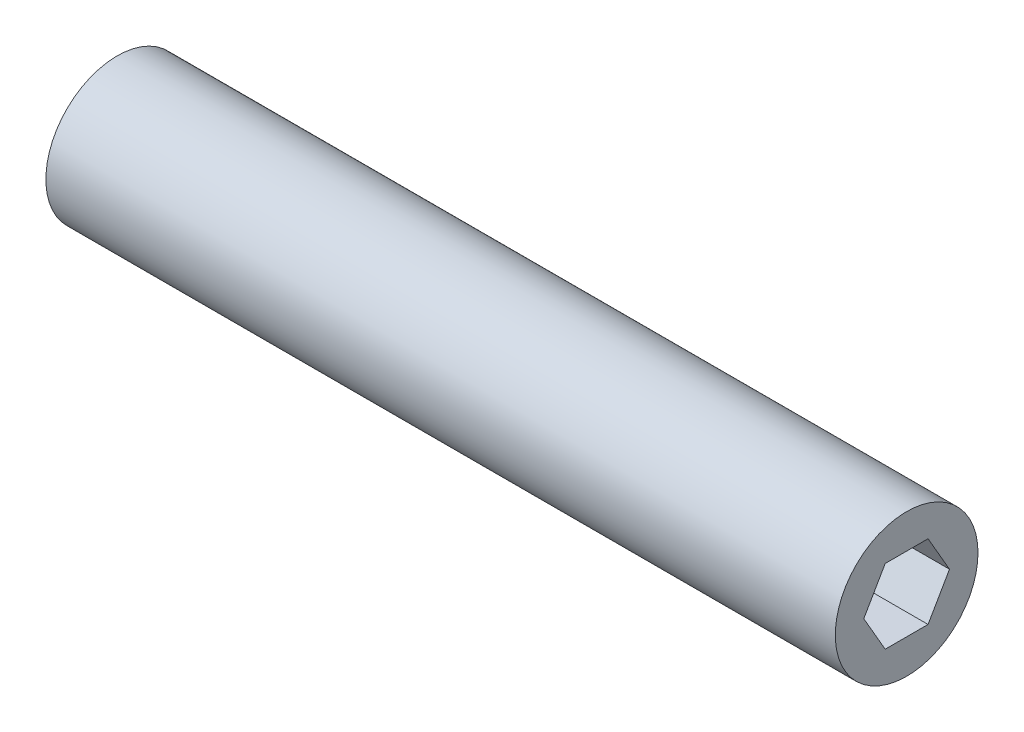
ISO-10303-21;
HEADER;
FILE_DESCRIPTION(('STEP AP214'),'2;1');
FILE_NAME('part.step','',(''),(''),'','','');
FILE_SCHEMA(('AUTOMOTIVE_DESIGN { 1 0 10303 214 1 1 1 1 }'));
ENDSEC;
DATA;
#1=APPLICATION_CONTEXT('core data for automotive mechanical design processes');
#2=APPLICATION_PROTOCOL_DEFINITION('international standard','automotive_design',2000,#1);
#3=PRODUCT_CONTEXT('',#1,'mechanical');
#4=PRODUCT('Part','Part','',(#3));
#5=PRODUCT_RELATED_PRODUCT_CATEGORY('part','',(#4));
#6=PRODUCT_DEFINITION_FORMATION('','',#4);
#7=PRODUCT_DEFINITION_CONTEXT('part definition',#1,'design');
#8=PRODUCT_DEFINITION('design','',#6,#7);
#9=PRODUCT_DEFINITION_SHAPE('','',#8);
#10=(LENGTH_UNIT() NAMED_UNIT(*) SI_UNIT(.MILLI.,.METRE.));
#11=(NAMED_UNIT(*) PLANE_ANGLE_UNIT() SI_UNIT($,.RADIAN.));
#12=(NAMED_UNIT(*) SI_UNIT($,.STERADIAN.) SOLID_ANGLE_UNIT());
#13=UNCERTAINTY_MEASURE_WITH_UNIT(LENGTH_MEASURE(1.E-05),#10,'distance_accuracy_value','');
#14=(GEOMETRIC_REPRESENTATION_CONTEXT(3) GLOBAL_UNCERTAINTY_ASSIGNED_CONTEXT((#13)) GLOBAL_UNIT_ASSIGNED_CONTEXT((#10,
#11,#12)) REPRESENTATION_CONTEXT('',''));
#15=CARTESIAN_POINT('',(0.,0.,0.));
#16=DIRECTION('',(0.,0.,1.));
#17=DIRECTION('',(1.,0.,0.));
#18=AXIS2_PLACEMENT_3D('',#15,#16,#17);
#19=CARTESIAN_POINT('',(140.49375,0.,0.));
#20=DIRECTION('',(1.,0.,0.));
#21=DIRECTION('',(0.,0.,-1.));
#22=AXIS2_PLACEMENT_3D('',#19,#20,#21);
#23=PLANE('',#22);
#24=CARTESIAN_POINT('',(140.49375,0.,0.));
#25=DIRECTION('',(1.,0.,0.));
#26=DIRECTION('',(0.,0.,-1.));
#27=AXIS2_PLACEMENT_3D('',#24,#25,#26);
#28=CIRCLE('',#27,12.7);
#29=CARTESIAN_POINT('',(140.49375,0.,-12.7));
#30=VERTEX_POINT('',#29);
#31=EDGE_CURVE('E11',#30,#30,#28,.T.);
#32=ORIENTED_EDGE('',*,*,#31,.T.);
#33=EDGE_LOOP('',(#32));
#34=FACE_BOUND('',#33,.T.);
#35=DIRECTION('',(0.,0.866025403784438,0.500000000000001));
#36=VECTOR('',#35,1.);
#37=CARTESIAN_POINT('',(140.49375,0.,-7.62564235545655));
#38=LINE('',#37,#36);
#39=CARTESIAN_POINT('',(140.49375,0.,-7.62564235545655));
#40=VERTEX_POINT('',#39);
#41=CARTESIAN_POINT('',(140.49375,6.60399999999999,-3.81282117772826));
#42=VERTEX_POINT('',#41);
#43=EDGE_CURVE('E94',#40,#42,#38,.T.);
#44=ORIENTED_EDGE('',*,*,#43,.F.);
#45=DIRECTION('',(0.,0.866025403784442,-0.499999999999995));
#46=VECTOR('',#45,1.);
#47=CARTESIAN_POINT('',(140.49375,-6.60399999999993,-3.81282117772835));
#48=LINE('',#47,#46);
#49=CARTESIAN_POINT('',(140.49375,-6.60399999999993,-3.81282117772835));
#50=VERTEX_POINT('',#49);
#51=EDGE_CURVE('E86',#50,#40,#48,.T.);
#52=ORIENTED_EDGE('',*,*,#51,.F.);
#53=DIRECTION('',(0.,0.,-1.));
#54=VECTOR('',#53,1.);
#55=CARTESIAN_POINT('',(140.49375,-6.60400000000001,3.81282117772821));
#56=LINE('',#55,#54);
#57=CARTESIAN_POINT('',(140.49375,-6.60400000000001,3.81282117772821));
#58=VERTEX_POINT('',#57);
#59=EDGE_CURVE('E114',#58,#50,#56,.T.);
#60=ORIENTED_EDGE('',*,*,#59,.F.);
#61=DIRECTION('',(0.,-0.866025403784435,-0.500000000000007));
#62=VECTOR('',#61,1.);
#63=CARTESIAN_POINT('',(140.49375,0.,7.62564235545655));
#64=LINE('',#63,#62);
#65=CARTESIAN_POINT('',(140.49375,0.,7.62564235545655));
#66=VERTEX_POINT('',#65);
#67=EDGE_CURVE('E112',#66,#58,#64,.T.);
#68=ORIENTED_EDGE('',*,*,#67,.F.);
#69=DIRECTION('',(0.,-0.866025403784442,0.499999999999995));
#70=VECTOR('',#69,1.);
#71=CARTESIAN_POINT('',(140.49375,6.60399999999996,3.81282117772831));
#72=LINE('',#71,#70);
#73=CARTESIAN_POINT('',(140.49375,6.60399999999996,3.81282117772831));
#74=VERTEX_POINT('',#73);
#75=EDGE_CURVE('E108',#74,#66,#72,.T.);
#76=ORIENTED_EDGE('',*,*,#75,.F.);
#77=DIRECTION('',(0.,0.,1.));
#78=VECTOR('',#77,1.);
#79=CARTESIAN_POINT('',(140.49375,6.60399999999999,-3.81282117772826));
#80=LINE('',#79,#78);
#81=EDGE_CURVE('E106',#42,#74,#80,.T.);
#82=ORIENTED_EDGE('',*,*,#81,.F.);
#83=EDGE_LOOP('',(#44,#52,#60,#68,#76,#82));
#84=FACE_BOUND('',#83,.T.);
#85=ADVANCED_FACE('F33',(#34,#84),#23,.T.);
#86=CARTESIAN_POINT('',(0.,0.,0.));
#87=DIRECTION('',(1.,0.,0.));
#88=DIRECTION('',(0.,0.,-1.));
#89=AXIS2_PLACEMENT_3D('',#86,#87,#88);
#90=PLANE('',#89);
#91=CARTESIAN_POINT('',(0.,0.,0.));
#92=DIRECTION('',(1.,0.,0.));
#93=DIRECTION('',(0.,0.,-1.));
#94=AXIS2_PLACEMENT_3D('',#91,#92,#93);
#95=CIRCLE('',#94,12.7);
#96=CARTESIAN_POINT('',(0.,0.,-12.7));
#97=VERTEX_POINT('',#96);
#98=EDGE_CURVE('E37',#97,#97,#95,.T.);
#99=ORIENTED_EDGE('',*,*,#98,.F.);
#100=EDGE_LOOP('',(#99));
#101=FACE_BOUND('',#100,.T.);
#102=DIRECTION('',(0.,0.866025403784442,-0.499999999999995));
#103=VECTOR('',#102,1.);
#104=CARTESIAN_POINT('',(0.,-6.60399999999993,-3.81282117772835));
#105=LINE('',#104,#103);
#106=CARTESIAN_POINT('',(0.,-6.60399999999993,-3.81282117772835));
#107=VERTEX_POINT('',#106);
#108=CARTESIAN_POINT('',(0.,0.,-7.62564235545655));
#109=VERTEX_POINT('',#108);
#110=EDGE_CURVE('E56',#107,#109,#105,.T.);
#111=ORIENTED_EDGE('',*,*,#110,.T.);
#112=DIRECTION('',(0.,0.866025403784438,0.500000000000001));
#113=VECTOR('',#112,1.);
#114=CARTESIAN_POINT('',(0.,0.,-7.62564235545655));
#115=LINE('',#114,#113);
#116=CARTESIAN_POINT('',(0.,6.60399999999999,-3.81282117772826));
#117=VERTEX_POINT('',#116);
#118=EDGE_CURVE('E101',#109,#117,#115,.T.);
#119=ORIENTED_EDGE('',*,*,#118,.T.);
#120=DIRECTION('',(0.,0.,1.));
#121=VECTOR('',#120,1.);
#122=CARTESIAN_POINT('',(0.,6.60399999999999,-3.81282117772826));
#123=LINE('',#122,#121);
#124=CARTESIAN_POINT('',(0.,6.60399999999996,3.81282117772831));
#125=VERTEX_POINT('',#124);
#126=EDGE_CURVE('E118',#117,#125,#123,.T.);
#127=ORIENTED_EDGE('',*,*,#126,.T.);
#128=DIRECTION('',(0.,-0.866025403784442,0.499999999999995));
#129=VECTOR('',#128,1.);
#130=CARTESIAN_POINT('',(0.,6.60399999999996,3.81282117772831));
#131=LINE('',#130,#129);
#132=CARTESIAN_POINT('',(0.,0.,7.62564235545655));
#133=VERTEX_POINT('',#132);
#134=EDGE_CURVE('E121',#125,#133,#131,.T.);
#135=ORIENTED_EDGE('',*,*,#134,.T.);
#136=DIRECTION('',(0.,-0.866025403784435,-0.500000000000007));
#137=VECTOR('',#136,1.);
#138=CARTESIAN_POINT('',(0.,0.,7.62564235545655));
#139=LINE('',#138,#137);
#140=CARTESIAN_POINT('',(0.,-6.60400000000001,3.81282117772821));
#141=VERTEX_POINT('',#140);
#142=EDGE_CURVE('E124',#133,#141,#139,.T.);
#143=ORIENTED_EDGE('',*,*,#142,.T.);
#144=DIRECTION('',(0.,0.,-1.));
#145=VECTOR('',#144,1.);
#146=CARTESIAN_POINT('',(0.,-6.60400000000001,3.81282117772821));
#147=LINE('',#146,#145);
#148=EDGE_CURVE('E95',#141,#107,#147,.T.);
#149=ORIENTED_EDGE('',*,*,#148,.T.);
#150=EDGE_LOOP('',(#111,#119,#127,#135,#143,#149));
#151=FACE_BOUND('',#150,.T.);
#152=ADVANCED_FACE('F141',(#101,#151),#90,.F.);
#153=CARTESIAN_POINT('',(140.49375,0.,0.));
#154=DIRECTION('',(-1.,0.,0.));
#155=DIRECTION('',(0.,0.,1.));
#156=AXIS2_PLACEMENT_3D('',#153,#154,#155);
#157=CYLINDRICAL_SURFACE('',#156,12.7);
#158=ORIENTED_EDGE('',*,*,#31,.F.);
#159=EDGE_LOOP('',(#158));
#160=FACE_BOUND('',#159,.T.);
#161=ORIENTED_EDGE('',*,*,#98,.T.);
#162=EDGE_LOOP('',(#161));
#163=FACE_BOUND('',#162,.T.);
#164=ADVANCED_FACE('F35',(#160,#163),#157,.T.);
#165=CARTESIAN_POINT('',(140.49375,-6.60399999999993,-3.81282117772835));
#166=DIRECTION('',(0.,0.499999999999995,0.866025403784441));
#167=DIRECTION('',(0.,-0.866025403784442,0.499999999999995));
#168=AXIS2_PLACEMENT_3D('',#165,#166,#167);
#169=PLANE('',#168);
#170=ORIENTED_EDGE('',*,*,#110,.F.);
#171=DIRECTION('',(-1.,0.,0.));
#172=VECTOR('',#171,1.);
#173=CARTESIAN_POINT('',(140.49375,-6.60399999999993,-3.81282117772835));
#174=LINE('',#173,#172);
#175=EDGE_CURVE('E90',#50,#107,#174,.T.);
#176=ORIENTED_EDGE('',*,*,#175,.F.);
#177=ORIENTED_EDGE('',*,*,#51,.T.);
#178=DIRECTION('',(-1.,0.,0.));
#179=VECTOR('',#178,1.);
#180=CARTESIAN_POINT('',(140.49375,0.,-7.62564235545655));
#181=LINE('',#180,#179);
#182=EDGE_CURVE('E89',#40,#109,#181,.T.);
#183=ORIENTED_EDGE('',*,*,#182,.T.);
#184=EDGE_LOOP('',(#170,#176,#177,#183));
#185=FACE_BOUND('',#184,.T.);
#186=ADVANCED_FACE('F88',(#185),#169,.T.);
#187=CARTESIAN_POINT('',(140.49375,0.,-7.62564235545655));
#188=DIRECTION('',(0.,-0.500000000000001,0.866025403784438));
#189=DIRECTION('',(0.,-0.866025403784438,-0.500000000000001));
#190=AXIS2_PLACEMENT_3D('',#187,#188,#189);
#191=PLANE('',#190);
#192=ORIENTED_EDGE('',*,*,#118,.F.);
#193=ORIENTED_EDGE('',*,*,#182,.F.);
#194=ORIENTED_EDGE('',*,*,#43,.T.);
#195=DIRECTION('',(-1.,0.,0.));
#196=VECTOR('',#195,1.);
#197=CARTESIAN_POINT('',(140.49375,6.60399999999999,-3.81282117772826));
#198=LINE('',#197,#196);
#199=EDGE_CURVE('E102',#42,#117,#198,.T.);
#200=ORIENTED_EDGE('',*,*,#199,.T.);
#201=EDGE_LOOP('',(#192,#193,#194,#200));
#202=FACE_BOUND('',#201,.T.);
#203=ADVANCED_FACE('F98',(#202),#191,.T.);
#204=CARTESIAN_POINT('',(140.49375,6.60399999999999,-3.81282117772826));
#205=DIRECTION('',(0.,-1.,0.));
#206=DIRECTION('',(0.,0.,-1.));
#207=AXIS2_PLACEMENT_3D('',#204,#205,#206);
#208=PLANE('',#207);
#209=ORIENTED_EDGE('',*,*,#126,.F.);
#210=ORIENTED_EDGE('',*,*,#199,.F.);
#211=ORIENTED_EDGE('',*,*,#81,.T.);
#212=DIRECTION('',(-1.,0.,0.));
#213=VECTOR('',#212,1.);
#214=CARTESIAN_POINT('',(140.49375,6.60399999999996,3.81282117772831));
#215=LINE('',#214,#213);
#216=EDGE_CURVE('E133',#74,#125,#215,.T.);
#217=ORIENTED_EDGE('',*,*,#216,.T.);
#218=EDGE_LOOP('',(#209,#210,#211,#217));
#219=FACE_BOUND('',#218,.T.);
#220=ADVANCED_FACE('F137',(#219),#208,.T.);
#221=CARTESIAN_POINT('',(140.49375,6.60399999999996,3.81282117772831));
#222=DIRECTION('',(0.,-0.499999999999995,-0.866025403784442));
#223=DIRECTION('',(0.,0.866025403784442,-0.499999999999995));
#224=AXIS2_PLACEMENT_3D('',#221,#222,#223);
#225=PLANE('',#224);
#226=ORIENTED_EDGE('',*,*,#134,.F.);
#227=ORIENTED_EDGE('',*,*,#216,.F.);
#228=ORIENTED_EDGE('',*,*,#75,.T.);
#229=DIRECTION('',(-1.,0.,0.));
#230=VECTOR('',#229,1.);
#231=CARTESIAN_POINT('',(140.49375,0.,7.62564235545655));
#232=LINE('',#231,#230);
#233=EDGE_CURVE('E131',#66,#133,#232,.T.);
#234=ORIENTED_EDGE('',*,*,#233,.T.);
#235=EDGE_LOOP('',(#226,#227,#228,#234));
#236=FACE_BOUND('',#235,.T.);
#237=ADVANCED_FACE('F149',(#236),#225,.T.);
#238=CARTESIAN_POINT('',(140.49375,0.,7.62564235545655));
#239=DIRECTION('',(0.,0.500000000000007,-0.866025403784435));
#240=DIRECTION('',(0.,0.866025403784435,0.500000000000007));
#241=AXIS2_PLACEMENT_3D('',#238,#239,#240);
#242=PLANE('',#241);
#243=ORIENTED_EDGE('',*,*,#142,.F.);
#244=ORIENTED_EDGE('',*,*,#233,.F.);
#245=ORIENTED_EDGE('',*,*,#67,.T.);
#246=DIRECTION('',(-1.,0.,0.));
#247=VECTOR('',#246,1.);
#248=CARTESIAN_POINT('',(140.49375,-6.60400000000001,3.81282117772821));
#249=LINE('',#248,#247);
#250=EDGE_CURVE('E48',#58,#141,#249,.T.);
#251=ORIENTED_EDGE('',*,*,#250,.T.);
#252=EDGE_LOOP('',(#243,#244,#245,#251));
#253=FACE_BOUND('',#252,.T.);
#254=ADVANCED_FACE('F147',(#253),#242,.T.);
#255=CARTESIAN_POINT('',(140.49375,-6.60400000000001,3.81282117772821));
#256=DIRECTION('',(0.,1.,0.));
#257=DIRECTION('',(0.,0.,1.));
#258=AXIS2_PLACEMENT_3D('',#255,#256,#257);
#259=PLANE('',#258);
#260=ORIENTED_EDGE('',*,*,#148,.F.);
#261=ORIENTED_EDGE('',*,*,#250,.F.);
#262=ORIENTED_EDGE('',*,*,#59,.T.);
#263=ORIENTED_EDGE('',*,*,#175,.T.);
#264=EDGE_LOOP('',(#260,#261,#262,#263));
#265=FACE_BOUND('',#264,.T.);
#266=ADVANCED_FACE('F143',(#265),#259,.T.);
#267=CLOSED_SHELL('',(#85,#152,#164,#186,#203,#220,#237,#254,#266));
#268=MANIFOLD_SOLID_BREP('B2',#267);
#269=ADVANCED_BREP_SHAPE_REPRESENTATION('',(#18,#268),#14);
#270=SHAPE_DEFINITION_REPRESENTATION(#9,#269);
ENDSEC;
END-ISO-10303-21;
